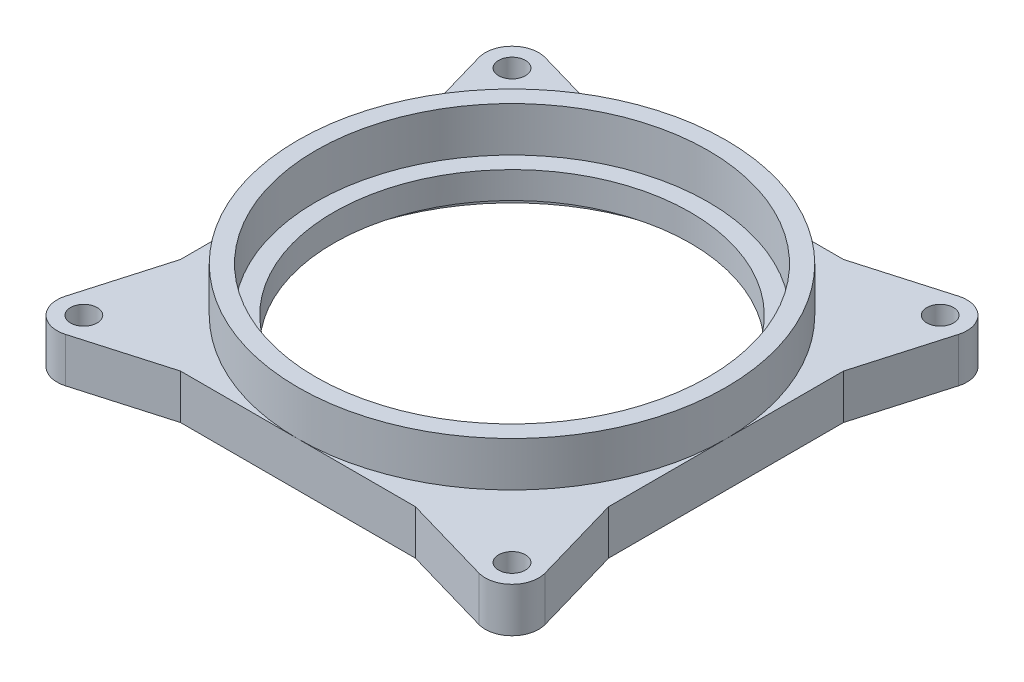
ISO-10303-21;
HEADER;
FILE_DESCRIPTION(('STEP AP214'),'2;1');
FILE_NAME('part.step','',(''),(''),'','','');
FILE_SCHEMA(('AUTOMOTIVE_DESIGN { 1 0 10303 214 1 1 1 1 }'));
ENDSEC;
DATA;
#1=APPLICATION_CONTEXT('core data for automotive mechanical design processes');
#2=APPLICATION_PROTOCOL_DEFINITION('international standard','automotive_design',2000,#1);
#3=PRODUCT_CONTEXT('',#1,'mechanical');
#4=PRODUCT('Part','Part','',(#3));
#5=PRODUCT_RELATED_PRODUCT_CATEGORY('part','',(#4));
#6=PRODUCT_DEFINITION_FORMATION('','',#4);
#7=PRODUCT_DEFINITION_CONTEXT('part definition',#1,'design');
#8=PRODUCT_DEFINITION('design','',#6,#7);
#9=PRODUCT_DEFINITION_SHAPE('','',#8);
#10=(LENGTH_UNIT() NAMED_UNIT(*) SI_UNIT(.MILLI.,.METRE.));
#11=(NAMED_UNIT(*) PLANE_ANGLE_UNIT() SI_UNIT($,.RADIAN.));
#12=(NAMED_UNIT(*) SI_UNIT($,.STERADIAN.) SOLID_ANGLE_UNIT());
#13=UNCERTAINTY_MEASURE_WITH_UNIT(LENGTH_MEASURE(1.E-05),#10,'distance_accuracy_value','');
#14=(GEOMETRIC_REPRESENTATION_CONTEXT(3) GLOBAL_UNCERTAINTY_ASSIGNED_CONTEXT((#13)) GLOBAL_UNIT_ASSIGNED_CONTEXT((#10,
#11,#12)) REPRESENTATION_CONTEXT('',''));
#15=CARTESIAN_POINT('',(0.,0.,0.));
#16=DIRECTION('',(0.,0.,1.));
#17=DIRECTION('',(1.,0.,0.));
#18=AXIS2_PLACEMENT_3D('',#15,#16,#17);
#19=CARTESIAN_POINT('',(0.,23.,0.));
#20=DIRECTION('',(0.,-1.,0.));
#21=DIRECTION('',(0.,0.,-1.));
#22=AXIS2_PLACEMENT_3D('',#19,#20,#21);
#23=CYLINDRICAL_SURFACE('',#22,20.);
#24=CARTESIAN_POINT('',(0.,2.,0.));
#25=DIRECTION('',(0.,-1.,0.));
#26=DIRECTION('',(0.,0.,-1.));
#27=AXIS2_PLACEMENT_3D('',#24,#25,#26);
#28=CIRCLE('',#27,20.);
#29=CARTESIAN_POINT('',(0.,2.,-20.));
#30=VERTEX_POINT('',#29);
#31=EDGE_CURVE('E592',#30,#30,#28,.T.);
#32=ORIENTED_EDGE('',*,*,#31,.T.);
#33=EDGE_LOOP('',(#32));
#34=FACE_BOUND('',#33,.T.);
#35=CARTESIAN_POINT('',(0.,5.,0.));
#36=DIRECTION('',(0.,1.,0.));
#37=DIRECTION('',(0.,0.,1.));
#38=AXIS2_PLACEMENT_3D('',#35,#36,#37);
#39=CIRCLE('',#38,20.);
#40=CARTESIAN_POINT('',(0.,5.,20.));
#41=VERTEX_POINT('',#40);
#42=EDGE_CURVE('E117',#41,#41,#39,.F.);
#43=ORIENTED_EDGE('',*,*,#42,.F.);
#44=EDGE_LOOP('',(#43));
#45=FACE_BOUND('',#44,.T.);
#46=ADVANCED_FACE('F113',(#34,#45),#23,.F.);
#47=CARTESIAN_POINT('',(0.,5.,0.));
#48=DIRECTION('',(0.,1.,0.));
#49=DIRECTION('',(0.,0.,1.));
#50=AXIS2_PLACEMENT_3D('',#47,#48,#49);
#51=CYLINDRICAL_SURFACE('',#50,24.);
#52=CARTESIAN_POINT('',(0.,5.,0.));
#53=DIRECTION('',(0.,1.,0.));
#54=DIRECTION('',(0.,0.,1.));
#55=AXIS2_PLACEMENT_3D('',#52,#53,#54);
#56=CIRCLE('',#55,24.);
#57=CARTESIAN_POINT('',(24.,5.,0.));
#58=VERTEX_POINT('',#57);
#59=CARTESIAN_POINT('',(0.,5.,-24.));
#60=VERTEX_POINT('',#59);
#61=EDGE_CURVE('E240',#58,#60,#56,.T.);
#62=ORIENTED_EDGE('',*,*,#61,.T.);
#63=CARTESIAN_POINT('',(0.,5.,0.));
#64=DIRECTION('',(0.,1.,0.));
#65=DIRECTION('',(0.,0.,1.));
#66=AXIS2_PLACEMENT_3D('',#63,#64,#65);
#67=CIRCLE('',#66,24.);
#68=CARTESIAN_POINT('',(-24.,5.,0.));
#69=VERTEX_POINT('',#68);
#70=EDGE_CURVE('E276',#60,#69,#67,.T.);
#71=ORIENTED_EDGE('',*,*,#70,.T.);
#72=CARTESIAN_POINT('',(0.,5.,0.));
#73=DIRECTION('',(0.,1.,0.));
#74=DIRECTION('',(0.,0.,1.));
#75=AXIS2_PLACEMENT_3D('',#72,#73,#74);
#76=CIRCLE('',#75,24.);
#77=CARTESIAN_POINT('',(0.,5.,24.));
#78=VERTEX_POINT('',#77);
#79=EDGE_CURVE('E263',#69,#78,#76,.T.);
#80=ORIENTED_EDGE('',*,*,#79,.T.);
#81=CARTESIAN_POINT('',(0.,5.,0.));
#82=DIRECTION('',(0.,1.,0.));
#83=DIRECTION('',(0.,0.,1.));
#84=AXIS2_PLACEMENT_3D('',#81,#82,#83);
#85=CIRCLE('',#84,24.);
#86=EDGE_CURVE('E260',#78,#58,#85,.T.);
#87=ORIENTED_EDGE('',*,*,#86,.T.);
#88=EDGE_LOOP('',(#62,#71,#80,#87));
#89=FACE_BOUND('',#88,.T.);
#90=CARTESIAN_POINT('',(0.,10.,0.));
#91=DIRECTION('',(0.,1.,0.));
#92=DIRECTION('',(0.,0.,1.));
#93=AXIS2_PLACEMENT_3D('',#90,#91,#92);
#94=CIRCLE('',#93,24.);
#95=CARTESIAN_POINT('',(0.,10.,24.));
#96=VERTEX_POINT('',#95);
#97=EDGE_CURVE('E590',#96,#96,#94,.T.);
#98=ORIENTED_EDGE('',*,*,#97,.F.);
#99=EDGE_LOOP('',(#98));
#100=FACE_BOUND('',#99,.T.);
#101=ADVANCED_FACE('F261',(#89,#100),#51,.T.);
#102=CARTESIAN_POINT('',(0.,25.,-24.));
#103=DIRECTION('',(0.,0.,-1.));
#104=DIRECTION('',(-1.,0.,0.));
#105=AXIS2_PLACEMENT_3D('',#102,#103,#104);
#106=PLANE('',#105);
#107=DIRECTION('',(-1.,0.,0.));
#108=VECTOR('',#107,1.);
#109=CARTESIAN_POINT('',(0.,5.,-24.));
#110=LINE('',#109,#108);
#111=CARTESIAN_POINT('',(-13.1690481051547,5.,-24.));
#112=VERTEX_POINT('',#111);
#113=EDGE_CURVE('E283',#60,#112,#110,.T.);
#114=ORIENTED_EDGE('',*,*,#113,.F.);
#115=DIRECTION('',(-1.,0.,0.));
#116=VECTOR('',#115,1.);
#117=CARTESIAN_POINT('',(0.,5.,-24.));
#118=LINE('',#117,#116);
#119=CARTESIAN_POINT('',(13.1690481051547,5.,-24.));
#120=VERTEX_POINT('',#119);
#121=EDGE_CURVE('E246',#120,#60,#118,.T.);
#122=ORIENTED_EDGE('',*,*,#121,.F.);
#123=DIRECTION('',(0.,-1.,0.));
#124=VECTOR('',#123,1.);
#125=CARTESIAN_POINT('',(13.1690481051547,25.,-24.));
#126=LINE('',#125,#124);
#127=CARTESIAN_POINT('',(13.1690481051547,0.,-24.));
#128=VERTEX_POINT('',#127);
#129=EDGE_CURVE('E380',#120,#128,#126,.T.);
#130=ORIENTED_EDGE('',*,*,#129,.T.);
#131=DIRECTION('',(1.,0.,0.));
#132=VECTOR('',#131,1.);
#133=CARTESIAN_POINT('',(0.,0.,-24.));
#134=LINE('',#133,#132);
#135=CARTESIAN_POINT('',(-13.1690481051547,0.,-24.));
#136=VERTEX_POINT('',#135);
#137=EDGE_CURVE('E312',#136,#128,#134,.T.);
#138=ORIENTED_EDGE('',*,*,#137,.F.);
#139=DIRECTION('',(0.,-1.,0.));
#140=VECTOR('',#139,1.);
#141=CARTESIAN_POINT('',(-13.1690481051547,25.,-24.));
#142=LINE('',#141,#140);
#143=EDGE_CURVE('E378',#112,#136,#142,.T.);
#144=ORIENTED_EDGE('',*,*,#143,.F.);
#145=EDGE_LOOP('',(#114,#122,#130,#138,#144));
#146=FACE_BOUND('',#145,.T.);
#147=ADVANCED_FACE('F462',(#146),#106,.T.);
#148=CARTESIAN_POINT('',(24.,25.,0.));
#149=DIRECTION('',(-1.,0.,0.));
#150=DIRECTION('',(0.,0.,1.));
#151=AXIS2_PLACEMENT_3D('',#148,#149,#150);
#152=PLANE('',#151);
#153=DIRECTION('',(0.,0.,-1.));
#154=VECTOR('',#153,1.);
#155=CARTESIAN_POINT('',(24.,5.,0.));
#156=LINE('',#155,#154);
#157=CARTESIAN_POINT('',(24.,5.,-13.1690481051547));
#158=VERTEX_POINT('',#157);
#159=EDGE_CURVE('E244',#58,#158,#156,.T.);
#160=ORIENTED_EDGE('',*,*,#159,.F.);
#161=DIRECTION('',(0.,0.,-1.));
#162=VECTOR('',#161,1.);
#163=CARTESIAN_POINT('',(24.,5.,0.));
#164=LINE('',#163,#162);
#165=CARTESIAN_POINT('',(24.,5.,13.1690481051547));
#166=VERTEX_POINT('',#165);
#167=EDGE_CURVE('E255',#166,#58,#164,.T.);
#168=ORIENTED_EDGE('',*,*,#167,.F.);
#169=DIRECTION('',(0.,-1.,0.));
#170=VECTOR('',#169,1.);
#171=CARTESIAN_POINT('',(24.,25.,13.1690481051547));
#172=LINE('',#171,#170);
#173=CARTESIAN_POINT('',(24.,0.,13.1690481051547));
#174=VERTEX_POINT('',#173);
#175=EDGE_CURVE('E136',#166,#174,#172,.T.);
#176=ORIENTED_EDGE('',*,*,#175,.T.);
#177=DIRECTION('',(0.,0.,-1.));
#178=VECTOR('',#177,1.);
#179=CARTESIAN_POINT('',(24.,0.,0.));
#180=LINE('',#179,#178);
#181=CARTESIAN_POINT('',(24.,0.,-13.1690481051547));
#182=VERTEX_POINT('',#181);
#183=EDGE_CURVE('E348',#174,#182,#180,.T.);
#184=ORIENTED_EDGE('',*,*,#183,.T.);
#185=DIRECTION('',(0.,-1.,0.));
#186=VECTOR('',#185,1.);
#187=CARTESIAN_POINT('',(24.,25.,-13.1690481051547));
#188=LINE('',#187,#186);
#189=EDGE_CURVE('E129',#158,#182,#188,.T.);
#190=ORIENTED_EDGE('',*,*,#189,.F.);
#191=EDGE_LOOP('',(#160,#168,#176,#184,#190));
#192=FACE_BOUND('',#191,.T.);
#193=ADVANCED_FACE('F253',(#192),#152,.F.);
#194=CARTESIAN_POINT('',(18.6538166551765,25.,5.37719325382419));
#195=DIRECTION('',(0.960874540801995,0.,0.276983964948434));
#196=DIRECTION('',(0.276983964948434,0.,-0.960874540801995));
#197=AXIS2_PLACEMENT_3D('',#194,#195,#196);
#198=PLANE('',#197);
#199=DIRECTION('',(0.,-1.,0.));
#200=VECTOR('',#199,1.);
#201=CARTESIAN_POINT('',(26.882623622406,25.,-23.1690481051547));
#202=LINE('',#201,#200);
#203=CARTESIAN_POINT('',(26.882623622406,5.,-23.1690481051547));
#204=VERTEX_POINT('',#203);
#205=CARTESIAN_POINT('',(26.882623622406,0.,-23.1690481051547));
#206=VERTEX_POINT('',#205);
#207=EDGE_CURVE('E12',#204,#206,#202,.T.);
#208=ORIENTED_EDGE('',*,*,#207,.F.);
#209=DIRECTION('',(0.276983964948434,0.,-0.960874540801995));
#210=VECTOR('',#209,1.);
#211=CARTESIAN_POINT('',(18.6538166551765,5.,5.37719325382419));
#212=LINE('',#211,#210);
#213=EDGE_CURVE('E256',#158,#204,#212,.T.);
#214=ORIENTED_EDGE('',*,*,#213,.F.);
#215=ORIENTED_EDGE('',*,*,#189,.T.);
#216=DIRECTION('',(-0.276983964948434,0.,0.960874540801995));
#217=VECTOR('',#216,1.);
#218=CARTESIAN_POINT('',(18.6538166551765,0.,5.37719325382419));
#219=LINE('',#218,#217);
#220=EDGE_CURVE('E303',#206,#182,#219,.T.);
#221=ORIENTED_EDGE('',*,*,#220,.F.);
#222=EDGE_LOOP('',(#208,#214,#215,#221));
#223=FACE_BOUND('',#222,.T.);
#224=ADVANCED_FACE('F399',(#223),#198,.T.);
#225=CARTESIAN_POINT('',(24.,25.,-24.));
#226=DIRECTION('',(0.,-1.,0.));
#227=DIRECTION('',(0.,0.,-1.));
#228=AXIS2_PLACEMENT_3D('',#225,#226,#227);
#229=CYLINDRICAL_SURFACE('',#228,3.);
#230=CARTESIAN_POINT('',(24.,5.,-24.));
#231=DIRECTION('',(0.,1.,0.));
#232=DIRECTION('',(0.,0.,1.));
#233=AXIS2_PLACEMENT_3D('',#230,#231,#232);
#234=CIRCLE('',#233,3.);
#235=CARTESIAN_POINT('',(23.1690481051547,5.,-26.882623622406));
#236=VERTEX_POINT('',#235);
#237=EDGE_CURVE('E398',#204,#236,#234,.T.);
#238=ORIENTED_EDGE('',*,*,#237,.F.);
#239=ORIENTED_EDGE('',*,*,#207,.T.);
#240=CARTESIAN_POINT('',(24.,0.,-24.));
#241=DIRECTION('',(0.,1.,0.));
#242=DIRECTION('',(0.,0.,1.));
#243=AXIS2_PLACEMENT_3D('',#240,#241,#242);
#244=CIRCLE('',#243,3.);
#245=CARTESIAN_POINT('',(23.1690481051547,0.,-26.882623622406));
#246=VERTEX_POINT('',#245);
#247=EDGE_CURVE('E306',#206,#246,#244,.T.);
#248=ORIENTED_EDGE('',*,*,#247,.T.);
#249=DIRECTION('',(0.,-1.,0.));
#250=VECTOR('',#249,1.);
#251=CARTESIAN_POINT('',(23.1690481051547,25.,-26.882623622406));
#252=LINE('',#251,#250);
#253=EDGE_CURVE('E122',#236,#246,#252,.T.);
#254=ORIENTED_EDGE('',*,*,#253,.F.);
#255=EDGE_LOOP('',(#238,#239,#248,#254));
#256=FACE_BOUND('',#255,.T.);
#257=ADVANCED_FACE('F396',(#256),#229,.T.);
#258=CARTESIAN_POINT('',(-5.37719325382418,25.,-18.6538166551765));
#259=DIRECTION('',(0.276983964948433,0.,0.960874540801995));
#260=DIRECTION('',(0.960874540801995,0.,-0.276983964948433));
#261=AXIS2_PLACEMENT_3D('',#258,#259,#260);
#262=PLANE('',#261);
#263=DIRECTION('',(-0.960874540801995,0.,0.276983964948433));
#264=VECTOR('',#263,1.);
#265=CARTESIAN_POINT('',(-5.37719325382418,5.,-18.6538166551765));
#266=LINE('',#265,#264);
#267=EDGE_CURVE('E388',#236,#120,#266,.T.);
#268=ORIENTED_EDGE('',*,*,#267,.F.);
#269=ORIENTED_EDGE('',*,*,#253,.T.);
#270=DIRECTION('',(-0.960874540801995,0.,0.276983964948433));
#271=VECTOR('',#270,1.);
#272=CARTESIAN_POINT('',(-5.37719325382418,0.,-18.6538166551765));
#273=LINE('',#272,#271);
#274=EDGE_CURVE('E309',#246,#128,#273,.T.);
#275=ORIENTED_EDGE('',*,*,#274,.T.);
#276=ORIENTED_EDGE('',*,*,#129,.F.);
#277=EDGE_LOOP('',(#268,#269,#275,#276));
#278=FACE_BOUND('',#277,.T.);
#279=ADVANCED_FACE('F386',(#278),#262,.F.);
#280=CARTESIAN_POINT('',(24.,25.,-24.));
#281=DIRECTION('',(0.,-1.,0.));
#282=DIRECTION('',(0.,0.,-1.));
#283=AXIS2_PLACEMENT_3D('',#280,#281,#282);
#284=CYLINDRICAL_SURFACE('',#283,1.5);
#285=CARTESIAN_POINT('',(24.,0.,-24.));
#286=DIRECTION('',(0.,1.,0.));
#287=DIRECTION('',(0.,0.,1.));
#288=AXIS2_PLACEMENT_3D('',#285,#286,#287);
#289=CIRCLE('',#288,1.5);
#290=CARTESIAN_POINT('',(24.,0.,-22.5));
#291=VERTEX_POINT('',#290);
#292=EDGE_CURVE('E350',#291,#291,#289,.T.);
#293=ORIENTED_EDGE('',*,*,#292,.F.);
#294=EDGE_LOOP('',(#293));
#295=FACE_BOUND('',#294,.T.);
#296=CARTESIAN_POINT('',(24.,5.,-24.));
#297=DIRECTION('',(0.,1.,0.));
#298=DIRECTION('',(0.,0.,1.));
#299=AXIS2_PLACEMENT_3D('',#296,#297,#298);
#300=CIRCLE('',#299,1.5);
#301=CARTESIAN_POINT('',(24.,5.,-22.5));
#302=VERTEX_POINT('',#301);
#303=EDGE_CURVE('E463',#302,#302,#300,.F.);
#304=ORIENTED_EDGE('',*,*,#303,.F.);
#305=EDGE_LOOP('',(#304));
#306=FACE_BOUND('',#305,.T.);
#307=ADVANCED_FACE('F514',(#295,#306),#284,.F.);
#308=CARTESIAN_POINT('',(-24.,25.,0.));
#309=DIRECTION('',(-1.,0.,0.));
#310=DIRECTION('',(0.,0.,1.));
#311=AXIS2_PLACEMENT_3D('',#308,#309,#310);
#312=PLANE('',#311);
#313=DIRECTION('',(0.,-1.,0.));
#314=VECTOR('',#313,1.);
#315=CARTESIAN_POINT('',(-24.,25.,13.1690481051547));
#316=LINE('',#315,#314);
#317=CARTESIAN_POINT('',(-24.,5.,13.1690481051547));
#318=VERTEX_POINT('',#317);
#319=CARTESIAN_POINT('',(-24.,0.,13.1690481051547));
#320=VERTEX_POINT('',#319);
#321=EDGE_CURVE('E370',#318,#320,#316,.T.);
#322=ORIENTED_EDGE('',*,*,#321,.F.);
#323=DIRECTION('',(0.,0.,1.));
#324=VECTOR('',#323,1.);
#325=CARTESIAN_POINT('',(-24.,5.,0.));
#326=LINE('',#325,#324);
#327=EDGE_CURVE('E471',#69,#318,#326,.T.);
#328=ORIENTED_EDGE('',*,*,#327,.F.);
#329=DIRECTION('',(0.,0.,1.));
#330=VECTOR('',#329,1.);
#331=CARTESIAN_POINT('',(-24.,5.,0.));
#332=LINE('',#331,#330);
#333=CARTESIAN_POINT('',(-24.,5.,-13.1690481051547));
#334=VERTEX_POINT('',#333);
#335=EDGE_CURVE('E291',#334,#69,#332,.T.);
#336=ORIENTED_EDGE('',*,*,#335,.F.);
#337=DIRECTION('',(0.,-1.,0.));
#338=VECTOR('',#337,1.);
#339=CARTESIAN_POINT('',(-24.,25.,-13.1690481051547));
#340=LINE('',#339,#338);
#341=CARTESIAN_POINT('',(-24.,0.,-13.1690481051547));
#342=VERTEX_POINT('',#341);
#343=EDGE_CURVE('E372',#334,#342,#340,.T.);
#344=ORIENTED_EDGE('',*,*,#343,.T.);
#345=DIRECTION('',(0.,0.,-1.));
#346=VECTOR('',#345,1.);
#347=CARTESIAN_POINT('',(-24.,0.,0.));
#348=LINE('',#347,#346);
#349=EDGE_CURVE('E324',#320,#342,#348,.T.);
#350=ORIENTED_EDGE('',*,*,#349,.F.);
#351=EDGE_LOOP('',(#322,#328,#336,#344,#350));
#352=FACE_BOUND('',#351,.T.);
#353=ADVANCED_FACE('F443',(#352),#312,.T.);
#354=CARTESIAN_POINT('',(-18.6538166551764,25.,-5.37719325382419));
#355=DIRECTION('',(-0.960874540801995,0.,-0.276983964948434));
#356=DIRECTION('',(-0.276983964948434,0.,0.960874540801995));
#357=AXIS2_PLACEMENT_3D('',#354,#355,#356);
#358=PLANE('',#357);
#359=DIRECTION('',(0.,-1.,0.));
#360=VECTOR('',#359,1.);
#361=CARTESIAN_POINT('',(-26.882623622406,25.,23.1690481051547));
#362=LINE('',#361,#360);
#363=CARTESIAN_POINT('',(-26.882623622406,5.,23.1690481051547));
#364=VERTEX_POINT('',#363);
#365=CARTESIAN_POINT('',(-26.882623622406,0.,23.1690481051547));
#366=VERTEX_POINT('',#365);
#367=EDGE_CURVE('E368',#364,#366,#362,.T.);
#368=ORIENTED_EDGE('',*,*,#367,.F.);
#369=DIRECTION('',(-0.276983964948434,0.,0.960874540801995));
#370=VECTOR('',#369,1.);
#371=CARTESIAN_POINT('',(-18.6538166551764,5.,-5.37719325382419));
#372=LINE('',#371,#370);
#373=EDGE_CURVE('E437',#318,#364,#372,.T.);
#374=ORIENTED_EDGE('',*,*,#373,.F.);
#375=ORIENTED_EDGE('',*,*,#321,.T.);
#376=DIRECTION('',(0.276983964948434,0.,-0.960874540801995));
#377=VECTOR('',#376,1.);
#378=CARTESIAN_POINT('',(-18.6538166551764,0.,-5.37719325382419));
#379=LINE('',#378,#377);
#380=EDGE_CURVE('E327',#366,#320,#379,.T.);
#381=ORIENTED_EDGE('',*,*,#380,.F.);
#382=EDGE_LOOP('',(#368,#374,#375,#381));
#383=FACE_BOUND('',#382,.T.);
#384=ADVANCED_FACE('F436',(#383),#358,.T.);
#385=CARTESIAN_POINT('',(-24.,25.,24.));
#386=DIRECTION('',(0.,-1.,0.));
#387=DIRECTION('',(0.,0.,-1.));
#388=AXIS2_PLACEMENT_3D('',#385,#386,#387);
#389=CYLINDRICAL_SURFACE('',#388,2.99999999999999);
#390=CARTESIAN_POINT('',(-24.,5.,24.));
#391=DIRECTION('',(0.,1.,0.));
#392=DIRECTION('',(0.,0.,1.));
#393=AXIS2_PLACEMENT_3D('',#390,#391,#392);
#394=CIRCLE('',#393,2.99999999999999);
#395=CARTESIAN_POINT('',(-23.1690481051547,5.,26.882623622406));
#396=VERTEX_POINT('',#395);
#397=EDGE_CURVE('E433',#364,#396,#394,.T.);
#398=ORIENTED_EDGE('',*,*,#397,.F.);
#399=ORIENTED_EDGE('',*,*,#367,.T.);
#400=CARTESIAN_POINT('',(-24.,0.,24.));
#401=DIRECTION('',(0.,1.,0.));
#402=DIRECTION('',(0.,0.,1.));
#403=AXIS2_PLACEMENT_3D('',#400,#401,#402);
#404=CIRCLE('',#403,2.99999999999999);
#405=CARTESIAN_POINT('',(-23.1690481051547,0.,26.882623622406));
#406=VERTEX_POINT('',#405);
#407=EDGE_CURVE('E330',#366,#406,#404,.T.);
#408=ORIENTED_EDGE('',*,*,#407,.T.);
#409=DIRECTION('',(0.,-1.,0.));
#410=VECTOR('',#409,1.);
#411=CARTESIAN_POINT('',(-23.1690481051547,25.,26.882623622406));
#412=LINE('',#411,#410);
#413=EDGE_CURVE('E366',#396,#406,#412,.T.);
#414=ORIENTED_EDGE('',*,*,#413,.F.);
#415=EDGE_LOOP('',(#398,#399,#408,#414));
#416=FACE_BOUND('',#415,.T.);
#417=ADVANCED_FACE('F431',(#416),#389,.T.);
#418=CARTESIAN_POINT('',(5.37719325382418,25.,18.6538166551765));
#419=DIRECTION('',(-0.276983964948433,0.,-0.960874540801995));
#420=DIRECTION('',(-0.960874540801995,0.,0.276983964948433));
#421=AXIS2_PLACEMENT_3D('',#418,#419,#420);
#422=PLANE('',#421);
#423=DIRECTION('',(0.960874540801995,0.,-0.276983964948433));
#424=VECTOR('',#423,1.);
#425=CARTESIAN_POINT('',(5.37719325382418,5.,18.6538166551765));
#426=LINE('',#425,#424);
#427=CARTESIAN_POINT('',(-13.1690481051547,5.,24.));
#428=VERTEX_POINT('',#427);
#429=EDGE_CURVE('E425',#396,#428,#426,.T.);
#430=ORIENTED_EDGE('',*,*,#429,.F.);
#431=ORIENTED_EDGE('',*,*,#413,.T.);
#432=DIRECTION('',(0.960874540801995,0.,-0.276983964948433));
#433=VECTOR('',#432,1.);
#434=CARTESIAN_POINT('',(5.37719325382418,0.,18.6538166551765));
#435=LINE('',#434,#433);
#436=CARTESIAN_POINT('',(-13.1690481051547,0.,24.));
#437=VERTEX_POINT('',#436);
#438=EDGE_CURVE('E333',#406,#437,#435,.T.);
#439=ORIENTED_EDGE('',*,*,#438,.T.);
#440=DIRECTION('',(0.,-1.,0.));
#441=VECTOR('',#440,1.);
#442=CARTESIAN_POINT('',(-13.1690481051547,25.,24.));
#443=LINE('',#442,#441);
#444=EDGE_CURVE('E364',#428,#437,#443,.T.);
#445=ORIENTED_EDGE('',*,*,#444,.F.);
#446=EDGE_LOOP('',(#430,#431,#439,#445));
#447=FACE_BOUND('',#446,.T.);
#448=ADVANCED_FACE('F424',(#447),#422,.F.);
#449=CARTESIAN_POINT('',(0.,25.,24.));
#450=DIRECTION('',(0.,0.,-1.));
#451=DIRECTION('',(-1.,0.,0.));
#452=AXIS2_PLACEMENT_3D('',#449,#450,#451);
#453=PLANE('',#452);
#454=DIRECTION('',(1.,0.,0.));
#455=VECTOR('',#454,1.);
#456=CARTESIAN_POINT('',(0.,5.,24.));
#457=LINE('',#456,#455);
#458=EDGE_CURVE('E421',#428,#78,#457,.T.);
#459=ORIENTED_EDGE('',*,*,#458,.F.);
#460=ORIENTED_EDGE('',*,*,#444,.T.);
#461=DIRECTION('',(1.,0.,0.));
#462=VECTOR('',#461,1.);
#463=CARTESIAN_POINT('',(0.,0.,24.));
#464=LINE('',#463,#462);
#465=CARTESIAN_POINT('',(13.1690481051547,0.,24.));
#466=VERTEX_POINT('',#465);
#467=EDGE_CURVE('E336',#437,#466,#464,.T.);
#468=ORIENTED_EDGE('',*,*,#467,.T.);
#469=DIRECTION('',(0.,-1.,0.));
#470=VECTOR('',#469,1.);
#471=CARTESIAN_POINT('',(13.1690481051547,25.,24.));
#472=LINE('',#471,#470);
#473=CARTESIAN_POINT('',(13.1690481051547,5.,24.));
#474=VERTEX_POINT('',#473);
#475=EDGE_CURVE('E362',#474,#466,#472,.T.);
#476=ORIENTED_EDGE('',*,*,#475,.F.);
#477=DIRECTION('',(1.,0.,0.));
#478=VECTOR('',#477,1.);
#479=CARTESIAN_POINT('',(0.,5.,24.));
#480=LINE('',#479,#478);
#481=EDGE_CURVE('E266',#78,#474,#480,.T.);
#482=ORIENTED_EDGE('',*,*,#481,.F.);
#483=EDGE_LOOP('',(#459,#460,#468,#476,#482));
#484=FACE_BOUND('',#483,.T.);
#485=ADVANCED_FACE('F419',(#484),#453,.F.);
#486=CARTESIAN_POINT('',(-24.,25.,24.));
#487=DIRECTION('',(0.,-1.,0.));
#488=DIRECTION('',(0.,0.,-1.));
#489=AXIS2_PLACEMENT_3D('',#486,#487,#488);
#490=CYLINDRICAL_SURFACE('',#489,1.49999999999999);
#491=CARTESIAN_POINT('',(-24.,0.,24.));
#492=DIRECTION('',(0.,1.,0.));
#493=DIRECTION('',(0.,0.,1.));
#494=AXIS2_PLACEMENT_3D('',#491,#492,#493);
#495=CIRCLE('',#494,1.49999999999999);
#496=CARTESIAN_POINT('',(-24.,0.,25.5));
#497=VERTEX_POINT('',#496);
#498=EDGE_CURVE('E297',#497,#497,#495,.T.);
#499=ORIENTED_EDGE('',*,*,#498,.F.);
#500=EDGE_LOOP('',(#499));
#501=FACE_BOUND('',#500,.T.);
#502=CARTESIAN_POINT('',(-24.,5.,24.));
#503=DIRECTION('',(0.,1.,0.));
#504=DIRECTION('',(0.,0.,1.));
#505=AXIS2_PLACEMENT_3D('',#502,#503,#504);
#506=CIRCLE('',#505,1.49999999999999);
#507=CARTESIAN_POINT('',(-24.,5.,25.5));
#508=VERTEX_POINT('',#507);
#509=EDGE_CURVE('E267',#508,#508,#506,.F.);
#510=ORIENTED_EDGE('',*,*,#509,.F.);
#511=EDGE_LOOP('',(#510));
#512=FACE_BOUND('',#511,.T.);
#513=ADVANCED_FACE('F115',(#501,#512),#490,.F.);
#514=CARTESIAN_POINT('',(5.37719325382418,25.,-18.6538166551765));
#515=DIRECTION('',(0.276983964948433,0.,-0.960874540801995));
#516=DIRECTION('',(-0.960874540801995,0.,-0.276983964948433));
#517=AXIS2_PLACEMENT_3D('',#514,#515,#516);
#518=PLANE('',#517);
#519=DIRECTION('',(0.,-1.,0.));
#520=VECTOR('',#519,1.);
#521=CARTESIAN_POINT('',(-23.1690481051547,25.,-26.882623622406));
#522=LINE('',#521,#520);
#523=CARTESIAN_POINT('',(-23.1690481051547,5.,-26.882623622406));
#524=VERTEX_POINT('',#523);
#525=CARTESIAN_POINT('',(-23.1690481051547,0.,-26.882623622406));
#526=VERTEX_POINT('',#525);
#527=EDGE_CURVE('E376',#524,#526,#522,.T.);
#528=ORIENTED_EDGE('',*,*,#527,.F.);
#529=DIRECTION('',(-0.960874540801995,0.,-0.276983964948433));
#530=VECTOR('',#529,1.);
#531=CARTESIAN_POINT('',(5.37719325382418,5.,-18.6538166551765));
#532=LINE('',#531,#530);
#533=EDGE_CURVE('E285',#112,#524,#532,.T.);
#534=ORIENTED_EDGE('',*,*,#533,.F.);
#535=ORIENTED_EDGE('',*,*,#143,.T.);
#536=DIRECTION('',(0.960874540801995,0.,0.276983964948433));
#537=VECTOR('',#536,1.);
#538=CARTESIAN_POINT('',(5.37719325382418,0.,-18.6538166551765));
#539=LINE('',#538,#537);
#540=EDGE_CURVE('E315',#526,#136,#539,.T.);
#541=ORIENTED_EDGE('',*,*,#540,.F.);
#542=EDGE_LOOP('',(#528,#534,#535,#541));
#543=FACE_BOUND('',#542,.T.);
#544=ADVANCED_FACE('F457',(#543),#518,.T.);
#545=CARTESIAN_POINT('',(-24.,25.,-24.));
#546=DIRECTION('',(0.,-1.,0.));
#547=DIRECTION('',(0.,0.,-1.));
#548=AXIS2_PLACEMENT_3D('',#545,#546,#547);
#549=CYLINDRICAL_SURFACE('',#548,2.99999999999999);
#550=DIRECTION('',(0.,-1.,0.));
#551=VECTOR('',#550,1.);
#552=CARTESIAN_POINT('',(-26.882623622406,25.,-23.1690481051547));
#553=LINE('',#552,#551);
#554=CARTESIAN_POINT('',(-26.882623622406,5.,-23.1690481051547));
#555=VERTEX_POINT('',#554);
#556=CARTESIAN_POINT('',(-26.882623622406,0.,-23.1690481051547));
#557=VERTEX_POINT('',#556);
#558=EDGE_CURVE('E374',#555,#557,#553,.T.);
#559=ORIENTED_EDGE('',*,*,#558,.F.);
#560=CARTESIAN_POINT('',(-24.,5.,-24.));
#561=DIRECTION('',(0.,1.,0.));
#562=DIRECTION('',(0.,0.,1.));
#563=AXIS2_PLACEMENT_3D('',#560,#561,#562);
#564=CIRCLE('',#563,2.99999999999999);
#565=EDGE_CURVE('E287',#524,#555,#564,.T.);
#566=ORIENTED_EDGE('',*,*,#565,.F.);
#567=ORIENTED_EDGE('',*,*,#527,.T.);
#568=CARTESIAN_POINT('',(-24.,0.,-24.));
#569=DIRECTION('',(0.,1.,0.));
#570=DIRECTION('',(0.,0.,1.));
#571=AXIS2_PLACEMENT_3D('',#568,#569,#570);
#572=CIRCLE('',#571,2.99999999999999);
#573=EDGE_CURVE('E318',#557,#526,#572,.F.);
#574=ORIENTED_EDGE('',*,*,#573,.F.);
#575=EDGE_LOOP('',(#559,#566,#567,#574));
#576=FACE_BOUND('',#575,.T.);
#577=ADVANCED_FACE('F453',(#576),#549,.T.);
#578=CARTESIAN_POINT('',(-18.6538166551764,25.,5.37719325382419));
#579=DIRECTION('',(0.960874540801995,0.,-0.276983964948434));
#580=DIRECTION('',(-0.276983964948434,0.,-0.960874540801995));
#581=AXIS2_PLACEMENT_3D('',#578,#579,#580);
#582=PLANE('',#581);
#583=DIRECTION('',(0.276983964948434,0.,0.960874540801995));
#584=VECTOR('',#583,1.);
#585=CARTESIAN_POINT('',(-18.6538166551764,5.,5.37719325382419));
#586=LINE('',#585,#584);
#587=EDGE_CURVE('E289',#555,#334,#586,.T.);
#588=ORIENTED_EDGE('',*,*,#587,.F.);
#589=ORIENTED_EDGE('',*,*,#558,.T.);
#590=DIRECTION('',(0.276983964948434,0.,0.960874540801995));
#591=VECTOR('',#590,1.);
#592=CARTESIAN_POINT('',(-18.6538166551764,0.,5.37719325382419));
#593=LINE('',#592,#591);
#594=EDGE_CURVE('E321',#557,#342,#593,.T.);
#595=ORIENTED_EDGE('',*,*,#594,.T.);
#596=ORIENTED_EDGE('',*,*,#343,.F.);
#597=EDGE_LOOP('',(#588,#589,#595,#596));
#598=FACE_BOUND('',#597,.T.);
#599=ADVANCED_FACE('F449',(#598),#582,.F.);
#600=CARTESIAN_POINT('',(-5.37719325382418,25.,18.6538166551765));
#601=DIRECTION('',(-0.276983964948433,0.,0.960874540801995));
#602=DIRECTION('',(0.960874540801995,0.,0.276983964948433));
#603=AXIS2_PLACEMENT_3D('',#600,#601,#602);
#604=PLANE('',#603);
#605=DIRECTION('',(0.,-1.,0.));
#606=VECTOR('',#605,1.);
#607=CARTESIAN_POINT('',(23.1690481051547,25.,26.882623622406));
#608=LINE('',#607,#606);
#609=CARTESIAN_POINT('',(23.1690481051547,5.,26.882623622406));
#610=VERTEX_POINT('',#609);
#611=CARTESIAN_POINT('',(23.1690481051547,0.,26.882623622406));
#612=VERTEX_POINT('',#611);
#613=EDGE_CURVE('E360',#610,#612,#608,.T.);
#614=ORIENTED_EDGE('',*,*,#613,.F.);
#615=DIRECTION('',(0.960874540801995,0.,0.276983964948433));
#616=VECTOR('',#615,1.);
#617=CARTESIAN_POINT('',(-5.37719325382418,5.,18.6538166551765));
#618=LINE('',#617,#616);
#619=EDGE_CURVE('E416',#474,#610,#618,.T.);
#620=ORIENTED_EDGE('',*,*,#619,.F.);
#621=ORIENTED_EDGE('',*,*,#475,.T.);
#622=DIRECTION('',(-0.960874540801995,0.,-0.276983964948433));
#623=VECTOR('',#622,1.);
#624=CARTESIAN_POINT('',(-5.37719325382418,0.,18.6538166551765));
#625=LINE('',#624,#623);
#626=EDGE_CURVE('E339',#612,#466,#625,.T.);
#627=ORIENTED_EDGE('',*,*,#626,.F.);
#628=EDGE_LOOP('',(#614,#620,#621,#627));
#629=FACE_BOUND('',#628,.T.);
#630=ADVANCED_FACE('F413',(#629),#604,.T.);
#631=CARTESIAN_POINT('',(24.,25.,24.));
#632=DIRECTION('',(0.,-1.,0.));
#633=DIRECTION('',(0.,0.,-1.));
#634=AXIS2_PLACEMENT_3D('',#631,#632,#633);
#635=CYLINDRICAL_SURFACE('',#634,3.);
#636=DIRECTION('',(0.,-1.,0.));
#637=VECTOR('',#636,1.);
#638=CARTESIAN_POINT('',(26.882623622406,25.,23.1690481051547));
#639=LINE('',#638,#637);
#640=CARTESIAN_POINT('',(26.882623622406,5.,23.1690481051547));
#641=VERTEX_POINT('',#640);
#642=CARTESIAN_POINT('',(26.882623622406,0.,23.1690481051547));
#643=VERTEX_POINT('',#642);
#644=EDGE_CURVE('E358',#641,#643,#639,.T.);
#645=ORIENTED_EDGE('',*,*,#644,.F.);
#646=CARTESIAN_POINT('',(24.,5.,24.));
#647=DIRECTION('',(0.,1.,0.));
#648=DIRECTION('',(0.,0.,1.));
#649=AXIS2_PLACEMENT_3D('',#646,#647,#648);
#650=CIRCLE('',#649,3.);
#651=EDGE_CURVE('E278',#610,#641,#650,.T.);
#652=ORIENTED_EDGE('',*,*,#651,.F.);
#653=ORIENTED_EDGE('',*,*,#613,.T.);
#654=CARTESIAN_POINT('',(24.,0.,24.));
#655=DIRECTION('',(0.,1.,0.));
#656=DIRECTION('',(0.,0.,1.));
#657=AXIS2_PLACEMENT_3D('',#654,#655,#656);
#658=CIRCLE('',#657,3.);
#659=EDGE_CURVE('E342',#643,#612,#658,.F.);
#660=ORIENTED_EDGE('',*,*,#659,.F.);
#661=EDGE_LOOP('',(#645,#652,#653,#660));
#662=FACE_BOUND('',#661,.T.);
#663=ADVANCED_FACE('F407',(#662),#635,.T.);
#664=CARTESIAN_POINT('',(18.6538166551765,25.,-5.37719325382419));
#665=DIRECTION('',(-0.960874540801995,0.,0.276983964948434));
#666=DIRECTION('',(0.276983964948434,0.,0.960874540801995));
#667=AXIS2_PLACEMENT_3D('',#664,#665,#666);
#668=PLANE('',#667);
#669=DIRECTION('',(-0.276983964948434,0.,-0.960874540801995));
#670=VECTOR('',#669,1.);
#671=CARTESIAN_POINT('',(18.6538166551765,5.,-5.37719325382419));
#672=LINE('',#671,#670);
#673=EDGE_CURVE('E272',#641,#166,#672,.T.);
#674=ORIENTED_EDGE('',*,*,#673,.F.);
#675=ORIENTED_EDGE('',*,*,#644,.T.);
#676=DIRECTION('',(-0.276983964948434,0.,-0.960874540801995));
#677=VECTOR('',#676,1.);
#678=CARTESIAN_POINT('',(18.6538166551765,0.,-5.37719325382419));
#679=LINE('',#678,#677);
#680=EDGE_CURVE('E345',#643,#174,#679,.T.);
#681=ORIENTED_EDGE('',*,*,#680,.T.);
#682=ORIENTED_EDGE('',*,*,#175,.F.);
#683=EDGE_LOOP('',(#674,#675,#681,#682));
#684=FACE_BOUND('',#683,.T.);
#685=ADVANCED_FACE('F403',(#684),#668,.F.);
#686=CARTESIAN_POINT('',(24.,25.,24.));
#687=DIRECTION('',(0.,-1.,0.));
#688=DIRECTION('',(0.,0.,-1.));
#689=AXIS2_PLACEMENT_3D('',#686,#687,#688);
#690=CYLINDRICAL_SURFACE('',#689,1.5);
#691=CARTESIAN_POINT('',(24.,0.,24.));
#692=DIRECTION('',(0.,1.,0.));
#693=DIRECTION('',(0.,0.,1.));
#694=AXIS2_PLACEMENT_3D('',#691,#692,#693);
#695=CIRCLE('',#694,1.5);
#696=CARTESIAN_POINT('',(24.,0.,25.5));
#697=VERTEX_POINT('',#696);
#698=EDGE_CURVE('E300',#697,#697,#695,.F.);
#699=ORIENTED_EDGE('',*,*,#698,.T.);
#700=EDGE_LOOP('',(#699));
#701=FACE_BOUND('',#700,.T.);
#702=CARTESIAN_POINT('',(24.,5.,24.));
#703=DIRECTION('',(0.,1.,0.));
#704=DIRECTION('',(0.,0.,1.));
#705=AXIS2_PLACEMENT_3D('',#702,#703,#704);
#706=CIRCLE('',#705,1.5);
#707=CARTESIAN_POINT('',(24.,5.,25.5));
#708=VERTEX_POINT('',#707);
#709=EDGE_CURVE('E273',#708,#708,#706,.F.);
#710=ORIENTED_EDGE('',*,*,#709,.F.);
#711=EDGE_LOOP('',(#710));
#712=FACE_BOUND('',#711,.T.);
#713=ADVANCED_FACE('F512',(#701,#712),#690,.F.);
#714=CARTESIAN_POINT('',(-24.,25.,-24.));
#715=DIRECTION('',(0.,-1.,0.));
#716=DIRECTION('',(0.,0.,-1.));
#717=AXIS2_PLACEMENT_3D('',#714,#715,#716);
#718=CYLINDRICAL_SURFACE('',#717,1.49999999999999);
#719=CARTESIAN_POINT('',(-24.,0.,-24.));
#720=DIRECTION('',(0.,1.,0.));
#721=DIRECTION('',(0.,0.,1.));
#722=AXIS2_PLACEMENT_3D('',#719,#720,#721);
#723=CIRCLE('',#722,1.49999999999999);
#724=CARTESIAN_POINT('',(-24.,0.,-22.5));
#725=VERTEX_POINT('',#724);
#726=EDGE_CURVE('E353',#725,#725,#723,.F.);
#727=ORIENTED_EDGE('',*,*,#726,.T.);
#728=EDGE_LOOP('',(#727));
#729=FACE_BOUND('',#728,.T.);
#730=CARTESIAN_POINT('',(-24.,5.,-24.));
#731=DIRECTION('',(0.,1.,0.));
#732=DIRECTION('',(0.,0.,1.));
#733=AXIS2_PLACEMENT_3D('',#730,#731,#732);
#734=CIRCLE('',#733,1.49999999999999);
#735=CARTESIAN_POINT('',(-24.,5.,-22.5));
#736=VERTEX_POINT('',#735);
#737=EDGE_CURVE('E294',#736,#736,#734,.F.);
#738=ORIENTED_EDGE('',*,*,#737,.F.);
#739=EDGE_LOOP('',(#738));
#740=FACE_BOUND('',#739,.T.);
#741=ADVANCED_FACE('F508',(#729,#740),#718,.F.);
#742=CARTESIAN_POINT('',(0.,0.,0.));
#743=DIRECTION('',(0.,1.,0.));
#744=DIRECTION('',(0.,0.,1.));
#745=AXIS2_PLACEMENT_3D('',#742,#743,#744);
#746=PLANE('',#745);
#747=CARTESIAN_POINT('',(0.,0.,0.));
#748=DIRECTION('',(0.,-1.,0.));
#749=DIRECTION('',(0.,0.,-1.));
#750=AXIS2_PLACEMENT_3D('',#747,#748,#749);
#751=CIRCLE('',#750,22.5);
#752=CARTESIAN_POINT('',(0.,0.,-22.5));
#753=VERTEX_POINT('',#752);
#754=EDGE_CURVE('E600',#753,#753,#751,.T.);
#755=ORIENTED_EDGE('',*,*,#754,.F.);
#756=EDGE_LOOP('',(#755));
#757=FACE_BOUND('',#756,.T.);
#758=ORIENTED_EDGE('',*,*,#498,.T.);
#759=EDGE_LOOP('',(#758));
#760=FACE_BOUND('',#759,.T.);
#761=ORIENTED_EDGE('',*,*,#698,.F.);
#762=EDGE_LOOP('',(#761));
#763=FACE_BOUND('',#762,.T.);
#764=ORIENTED_EDGE('',*,*,#220,.T.);
#765=ORIENTED_EDGE('',*,*,#183,.F.);
#766=ORIENTED_EDGE('',*,*,#680,.F.);
#767=ORIENTED_EDGE('',*,*,#659,.T.);
#768=ORIENTED_EDGE('',*,*,#626,.T.);
#769=ORIENTED_EDGE('',*,*,#467,.F.);
#770=ORIENTED_EDGE('',*,*,#438,.F.);
#771=ORIENTED_EDGE('',*,*,#407,.F.);
#772=ORIENTED_EDGE('',*,*,#380,.T.);
#773=ORIENTED_EDGE('',*,*,#349,.T.);
#774=ORIENTED_EDGE('',*,*,#594,.F.);
#775=ORIENTED_EDGE('',*,*,#573,.T.);
#776=ORIENTED_EDGE('',*,*,#540,.T.);
#777=ORIENTED_EDGE('',*,*,#137,.T.);
#778=ORIENTED_EDGE('',*,*,#274,.F.);
#779=ORIENTED_EDGE('',*,*,#247,.F.);
#780=EDGE_LOOP('',(#764,#765,#766,#767,#768,#769,#770,#771,#772,#773,#774,#775,#776,#777,#778,#779));
#781=FACE_BOUND('',#780,.T.);
#782=ORIENTED_EDGE('',*,*,#292,.T.);
#783=EDGE_LOOP('',(#782));
#784=FACE_BOUND('',#783,.T.);
#785=ORIENTED_EDGE('',*,*,#726,.F.);
#786=EDGE_LOOP('',(#785));
#787=FACE_BOUND('',#786,.T.);
#788=ADVANCED_FACE('F393',(#757,#760,#763,#781,#784,#787),#746,.F.);
#789=CARTESIAN_POINT('',(0.,5.,0.));
#790=DIRECTION('',(0.,1.,0.));
#791=DIRECTION('',(0.,0.,1.));
#792=AXIS2_PLACEMENT_3D('',#789,#790,#791);
#793=PLANE('',#792);
#794=ORIENTED_EDGE('',*,*,#70,.F.);
#795=ORIENTED_EDGE('',*,*,#113,.T.);
#796=ORIENTED_EDGE('',*,*,#533,.T.);
#797=ORIENTED_EDGE('',*,*,#565,.T.);
#798=ORIENTED_EDGE('',*,*,#587,.T.);
#799=ORIENTED_EDGE('',*,*,#335,.T.);
#800=EDGE_LOOP('',(#794,#795,#796,#797,#798,#799));
#801=FACE_BOUND('',#800,.T.);
#802=ORIENTED_EDGE('',*,*,#737,.T.);
#803=EDGE_LOOP('',(#802));
#804=FACE_BOUND('',#803,.T.);
#805=ADVANCED_FACE('F505',(#801,#804),#793,.T.);
#806=CARTESIAN_POINT('',(0.,5.,0.));
#807=DIRECTION('',(0.,1.,0.));
#808=DIRECTION('',(0.,0.,1.));
#809=AXIS2_PLACEMENT_3D('',#806,#807,#808);
#810=PLANE('',#809);
#811=ORIENTED_EDGE('',*,*,#86,.F.);
#812=ORIENTED_EDGE('',*,*,#481,.T.);
#813=ORIENTED_EDGE('',*,*,#619,.T.);
#814=ORIENTED_EDGE('',*,*,#651,.T.);
#815=ORIENTED_EDGE('',*,*,#673,.T.);
#816=ORIENTED_EDGE('',*,*,#167,.T.);
#817=EDGE_LOOP('',(#811,#812,#813,#814,#815,#816));
#818=FACE_BOUND('',#817,.T.);
#819=ORIENTED_EDGE('',*,*,#709,.T.);
#820=EDGE_LOOP('',(#819));
#821=FACE_BOUND('',#820,.T.);
#822=ADVANCED_FACE('F269',(#818,#821),#810,.T.);
#823=CARTESIAN_POINT('',(0.,5.,0.));
#824=DIRECTION('',(0.,1.,0.));
#825=DIRECTION('',(0.,0.,1.));
#826=AXIS2_PLACEMENT_3D('',#823,#824,#825);
#827=PLANE('',#826);
#828=ORIENTED_EDGE('',*,*,#79,.F.);
#829=ORIENTED_EDGE('',*,*,#327,.T.);
#830=ORIENTED_EDGE('',*,*,#373,.T.);
#831=ORIENTED_EDGE('',*,*,#397,.T.);
#832=ORIENTED_EDGE('',*,*,#429,.T.);
#833=ORIENTED_EDGE('',*,*,#458,.T.);
#834=EDGE_LOOP('',(#828,#829,#830,#831,#832,#833));
#835=FACE_BOUND('',#834,.T.);
#836=ORIENTED_EDGE('',*,*,#509,.T.);
#837=EDGE_LOOP('',(#836));
#838=FACE_BOUND('',#837,.T.);
#839=ADVANCED_FACE('F482',(#835,#838),#827,.T.);
#840=CARTESIAN_POINT('',(0.,5.,0.));
#841=DIRECTION('',(0.,1.,0.));
#842=DIRECTION('',(0.,0.,1.));
#843=AXIS2_PLACEMENT_3D('',#840,#841,#842);
#844=PLANE('',#843);
#845=ORIENTED_EDGE('',*,*,#61,.F.);
#846=ORIENTED_EDGE('',*,*,#159,.T.);
#847=ORIENTED_EDGE('',*,*,#213,.T.);
#848=ORIENTED_EDGE('',*,*,#237,.T.);
#849=ORIENTED_EDGE('',*,*,#267,.T.);
#850=ORIENTED_EDGE('',*,*,#121,.T.);
#851=EDGE_LOOP('',(#845,#846,#847,#848,#849,#850));
#852=FACE_BOUND('',#851,.T.);
#853=ORIENTED_EDGE('',*,*,#303,.T.);
#854=EDGE_LOOP('',(#853));
#855=FACE_BOUND('',#854,.T.);
#856=ADVANCED_FACE('F242',(#852,#855),#844,.T.);
#857=CARTESIAN_POINT('',(0.,2.,0.));
#858=DIRECTION('',(0.,-1.,0.));
#859=DIRECTION('',(0.,0.,-1.));
#860=AXIS2_PLACEMENT_3D('',#857,#858,#859);
#861=CYLINDRICAL_SURFACE('',#860,22.5);
#862=CARTESIAN_POINT('',(0.,2.,0.));
#863=DIRECTION('',(0.,-1.,0.));
#864=DIRECTION('',(0.,0.,-1.));
#865=AXIS2_PLACEMENT_3D('',#862,#863,#864);
#866=CIRCLE('',#865,22.5);
#867=CARTESIAN_POINT('',(0.,2.,-22.5));
#868=VERTEX_POINT('',#867);
#869=EDGE_CURVE('E251',#868,#868,#866,.T.);
#870=ORIENTED_EDGE('',*,*,#869,.F.);
#871=EDGE_LOOP('',(#870));
#872=FACE_BOUND('',#871,.T.);
#873=ORIENTED_EDGE('',*,*,#754,.T.);
#874=EDGE_LOOP('',(#873));
#875=FACE_BOUND('',#874,.T.);
#876=ADVANCED_FACE('F564',(#872,#875),#861,.F.);
#877=CARTESIAN_POINT('',(0.,2.,0.));
#878=DIRECTION('',(0.,-1.,0.));
#879=DIRECTION('',(0.,0.,-1.));
#880=AXIS2_PLACEMENT_3D('',#877,#878,#879);
#881=PLANE('',#880);
#882=ORIENTED_EDGE('',*,*,#31,.F.);
#883=EDGE_LOOP('',(#882));
#884=FACE_BOUND('',#883,.T.);
#885=ORIENTED_EDGE('',*,*,#869,.T.);
#886=EDGE_LOOP('',(#885));
#887=FACE_BOUND('',#886,.T.);
#888=ADVANCED_FACE('F567',(#884,#887),#881,.T.);
#889=CARTESIAN_POINT('',(0.,10.,0.));
#890=DIRECTION('',(0.,1.,0.));
#891=DIRECTION('',(0.,0.,1.));
#892=AXIS2_PLACEMENT_3D('',#889,#890,#891);
#893=PLANE('',#892);
#894=CARTESIAN_POINT('',(0.,10.,0.));
#895=DIRECTION('',(0.,1.,0.));
#896=DIRECTION('',(0.,0.,1.));
#897=AXIS2_PLACEMENT_3D('',#894,#895,#896);
#898=CIRCLE('',#897,22.);
#899=CARTESIAN_POINT('',(0.,10.,22.));
#900=VERTEX_POINT('',#899);
#901=EDGE_CURVE('E594',#900,#900,#898,.T.);
#902=ORIENTED_EDGE('',*,*,#901,.F.);
#903=EDGE_LOOP('',(#902));
#904=FACE_BOUND('',#903,.T.);
#905=ORIENTED_EDGE('',*,*,#97,.T.);
#906=EDGE_LOOP('',(#905));
#907=FACE_BOUND('',#906,.T.);
#908=ADVANCED_FACE('F571',(#904,#907),#893,.T.);
#909=CARTESIAN_POINT('',(0.,5.,0.));
#910=DIRECTION('',(0.,1.,0.));
#911=DIRECTION('',(0.,0.,1.));
#912=AXIS2_PLACEMENT_3D('',#909,#910,#911);
#913=PLANE('',#912);
#914=CARTESIAN_POINT('',(0.,5.,0.));
#915=DIRECTION('',(0.,1.,0.));
#916=DIRECTION('',(0.,0.,1.));
#917=AXIS2_PLACEMENT_3D('',#914,#915,#916);
#918=CIRCLE('',#917,22.);
#919=CARTESIAN_POINT('',(0.,5.,22.));
#920=VERTEX_POINT('',#919);
#921=EDGE_CURVE('E587',#920,#920,#918,.T.);
#922=ORIENTED_EDGE('',*,*,#921,.T.);
#923=EDGE_LOOP('',(#922));
#924=FACE_BOUND('',#923,.T.);
#925=ORIENTED_EDGE('',*,*,#42,.T.);
#926=EDGE_LOOP('',(#925));
#927=FACE_BOUND('',#926,.T.);
#928=ADVANCED_FACE('F574',(#924,#927),#913,.T.);
#929=CARTESIAN_POINT('',(0.,5.,0.));
#930=DIRECTION('',(0.,1.,0.));
#931=DIRECTION('',(0.,0.,1.));
#932=AXIS2_PLACEMENT_3D('',#929,#930,#931);
#933=CYLINDRICAL_SURFACE('',#932,22.);
#934=ORIENTED_EDGE('',*,*,#921,.F.);
#935=EDGE_LOOP('',(#934));
#936=FACE_BOUND('',#935,.T.);
#937=ORIENTED_EDGE('',*,*,#901,.T.);
#938=EDGE_LOOP('',(#937));
#939=FACE_BOUND('',#938,.T.);
#940=ADVANCED_FACE('F576',(#936,#939),#933,.F.);
#941=CLOSED_SHELL('',(#46,#101,#147,#193,#224,#257,#279,#307,#353,#384,#417,#448,#485,#513,#544,
#577,#599,#630,#663,#685,#713,#741,#788,#805,#822,#839,#856,#876,#888,#908,#928,#940));
#942=MANIFOLD_SOLID_BREP('B2',#941);
#943=ADVANCED_BREP_SHAPE_REPRESENTATION('',(#18,#942),#14);
#944=SHAPE_DEFINITION_REPRESENTATION(#9,#943);
ENDSEC;
END-ISO-10303-21;
